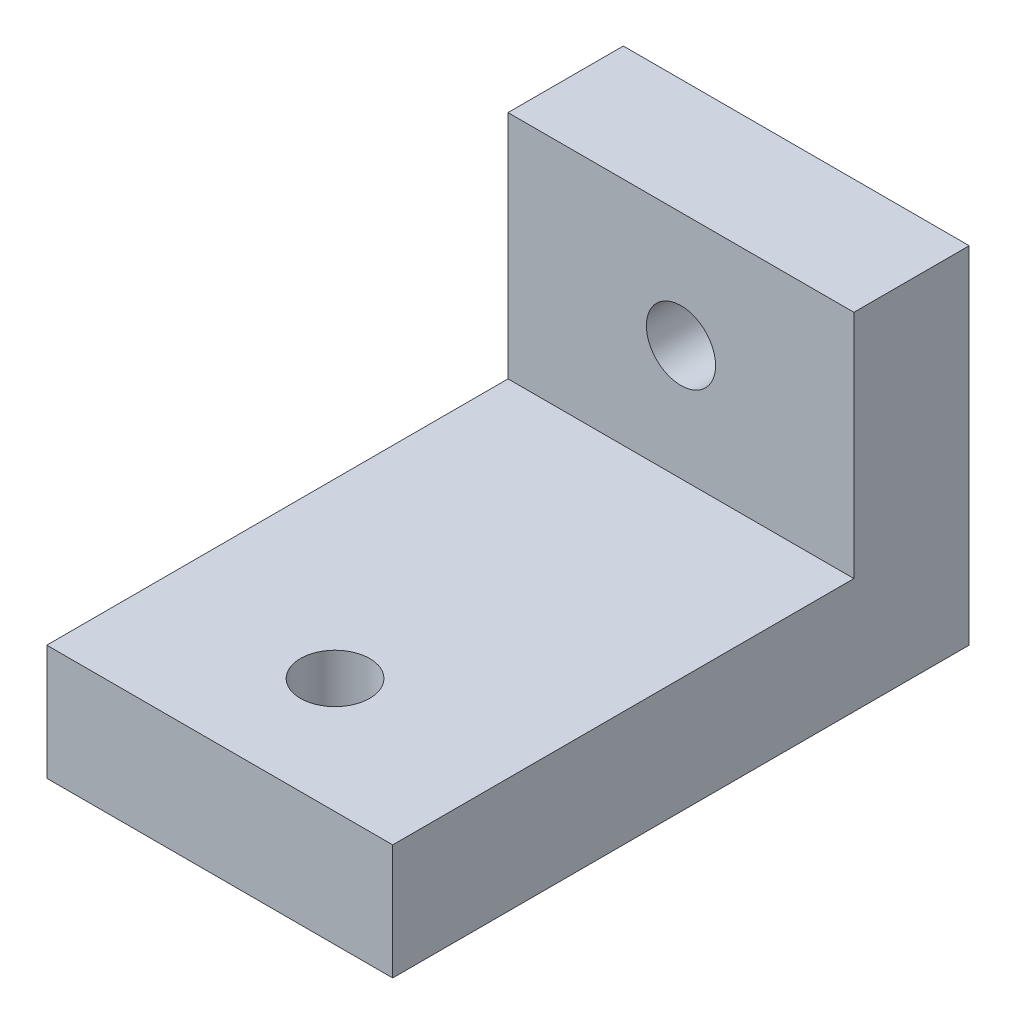
ISO-10303-21;
HEADER;
FILE_DESCRIPTION(('STEP AP214'),'2;1');
FILE_NAME('part.step','',(''),(''),'','','');
FILE_SCHEMA(('AUTOMOTIVE_DESIGN { 1 0 10303 214 1 1 1 1 }'));
ENDSEC;
DATA;
#1=APPLICATION_CONTEXT('core data for automotive mechanical design processes');
#2=APPLICATION_PROTOCOL_DEFINITION('international standard','automotive_design',2000,#1);
#3=PRODUCT_CONTEXT('',#1,'mechanical');
#4=PRODUCT('Part','Part','',(#3));
#5=PRODUCT_RELATED_PRODUCT_CATEGORY('part','',(#4));
#6=PRODUCT_DEFINITION_FORMATION('','',#4);
#7=PRODUCT_DEFINITION_CONTEXT('part definition',#1,'design');
#8=PRODUCT_DEFINITION('design','',#6,#7);
#9=PRODUCT_DEFINITION_SHAPE('','',#8);
#10=(LENGTH_UNIT() NAMED_UNIT(*) SI_UNIT(.MILLI.,.METRE.));
#11=(NAMED_UNIT(*) PLANE_ANGLE_UNIT() SI_UNIT($,.RADIAN.));
#12=(NAMED_UNIT(*) SI_UNIT($,.STERADIAN.) SOLID_ANGLE_UNIT());
#13=UNCERTAINTY_MEASURE_WITH_UNIT(LENGTH_MEASURE(1.E-05),#10,'distance_accuracy_value','');
#14=(GEOMETRIC_REPRESENTATION_CONTEXT(3) GLOBAL_UNCERTAINTY_ASSIGNED_CONTEXT((#13)) GLOBAL_UNIT_ASSIGNED_CONTEXT((#10,
#11,#12)) REPRESENTATION_CONTEXT('',''));
#15=CARTESIAN_POINT('',(0.,0.,0.));
#16=DIRECTION('',(0.,0.,1.));
#17=DIRECTION('',(1.,0.,0.));
#18=AXIS2_PLACEMENT_3D('',#15,#16,#17);
#19=CARTESIAN_POINT('',(7.5,5.,-12.5));
#20=DIRECTION('',(-1.,0.,0.));
#21=DIRECTION('',(0.,0.,1.));
#22=AXIS2_PLACEMENT_3D('',#19,#20,#21);
#23=PLANE('',#22);
#24=DIRECTION('',(0.,0.,-1.));
#25=VECTOR('',#24,1.);
#26=CARTESIAN_POINT('',(7.5,0.,-12.5));
#27=LINE('',#26,#25);
#28=CARTESIAN_POINT('',(7.5,0.,12.5));
#29=VERTEX_POINT('',#28);
#30=CARTESIAN_POINT('',(7.5,0.,-12.5));
#31=VERTEX_POINT('',#30);
#32=EDGE_CURVE('E91',#29,#31,#27,.T.);
#33=ORIENTED_EDGE('',*,*,#32,.T.);
#34=DIRECTION('',(0.,-1.,0.));
#35=VECTOR('',#34,1.);
#36=CARTESIAN_POINT('',(7.5,5.,-12.5));
#37=LINE('',#36,#35);
#38=CARTESIAN_POINT('',(7.5,15.,-12.5));
#39=VERTEX_POINT('',#38);
#40=EDGE_CURVE('E11',#39,#31,#37,.T.);
#41=ORIENTED_EDGE('',*,*,#40,.F.);
#42=DIRECTION('',(0.,0.,-1.));
#43=VECTOR('',#42,1.);
#44=CARTESIAN_POINT('',(7.5,15.,-12.5));
#45=LINE('',#44,#43);
#46=CARTESIAN_POINT('',(7.5,15.,-7.5));
#47=VERTEX_POINT('',#46);
#48=EDGE_CURVE('E128',#47,#39,#45,.T.);
#49=ORIENTED_EDGE('',*,*,#48,.F.);
#50=DIRECTION('',(0.,-1.,0.));
#51=VECTOR('',#50,1.);
#52=CARTESIAN_POINT('',(7.5,15.,-7.5));
#53=LINE('',#52,#51);
#54=CARTESIAN_POINT('',(7.5,5.,-7.5));
#55=VERTEX_POINT('',#54);
#56=EDGE_CURVE('E100',#47,#55,#53,.T.);
#57=ORIENTED_EDGE('',*,*,#56,.T.);
#58=DIRECTION('',(0.,0.,-1.));
#59=VECTOR('',#58,1.);
#60=CARTESIAN_POINT('',(7.5,5.,-12.5));
#61=LINE('',#60,#59);
#62=CARTESIAN_POINT('',(7.5,5.,12.5));
#63=VERTEX_POINT('',#62);
#64=EDGE_CURVE('E85',#63,#55,#61,.T.);
#65=ORIENTED_EDGE('',*,*,#64,.F.);
#66=DIRECTION('',(0.,-1.,0.));
#67=VECTOR('',#66,1.);
#68=CARTESIAN_POINT('',(7.5,5.,12.5));
#69=LINE('',#68,#67);
#70=EDGE_CURVE('E78',#63,#29,#69,.T.);
#71=ORIENTED_EDGE('',*,*,#70,.T.);
#72=EDGE_LOOP('',(#33,#41,#49,#57,#65,#71));
#73=FACE_BOUND('',#72,.T.);
#74=ADVANCED_FACE('F35',(#73),#23,.F.);
#75=CARTESIAN_POINT('',(-7.5,5.,-12.5));
#76=DIRECTION('',(0.,0.,1.));
#77=DIRECTION('',(1.,0.,0.));
#78=AXIS2_PLACEMENT_3D('',#75,#76,#77);
#79=PLANE('',#78);
#80=CARTESIAN_POINT('',(0.,10.,-12.5));
#81=DIRECTION('',(0.,0.,1.));
#82=DIRECTION('',(1.,0.,0.));
#83=AXIS2_PLACEMENT_3D('',#80,#81,#82);
#84=CIRCLE('',#83,1.5);
#85=CARTESIAN_POINT('',(1.5,10.,-12.5));
#86=VERTEX_POINT('',#85);
#87=EDGE_CURVE('E150',#86,#86,#84,.T.);
#88=ORIENTED_EDGE('',*,*,#87,.T.);
#89=EDGE_LOOP('',(#88));
#90=FACE_BOUND('',#89,.T.);
#91=DIRECTION('',(-1.,0.,0.));
#92=VECTOR('',#91,1.);
#93=CARTESIAN_POINT('',(-7.5,0.,-12.5));
#94=LINE('',#93,#92);
#95=CARTESIAN_POINT('',(-7.5,0.,-12.5));
#96=VERTEX_POINT('',#95);
#97=EDGE_CURVE('E95',#31,#96,#94,.T.);
#98=ORIENTED_EDGE('',*,*,#97,.T.);
#99=DIRECTION('',(0.,-1.,0.));
#100=VECTOR('',#99,1.);
#101=CARTESIAN_POINT('',(-7.5,5.,-12.5));
#102=LINE('',#101,#100);
#103=CARTESIAN_POINT('',(-7.5,15.,-12.5));
#104=VERTEX_POINT('',#103);
#105=EDGE_CURVE('E43',#104,#96,#102,.T.);
#106=ORIENTED_EDGE('',*,*,#105,.F.);
#107=DIRECTION('',(-1.,0.,0.));
#108=VECTOR('',#107,1.);
#109=CARTESIAN_POINT('',(-7.5,15.,-12.5));
#110=LINE('',#109,#108);
#111=EDGE_CURVE('E120',#39,#104,#110,.T.);
#112=ORIENTED_EDGE('',*,*,#111,.F.);
#113=ORIENTED_EDGE('',*,*,#40,.T.);
#114=EDGE_LOOP('',(#98,#106,#112,#113));
#115=FACE_BOUND('',#114,.T.);
#116=ADVANCED_FACE('F118',(#90,#115),#79,.F.);
#117=CARTESIAN_POINT('',(-7.5,5.,-12.5));
#118=DIRECTION('',(1.,0.,0.));
#119=DIRECTION('',(0.,0.,-1.));
#120=AXIS2_PLACEMENT_3D('',#117,#118,#119);
#121=PLANE('',#120);
#122=DIRECTION('',(0.,0.,1.));
#123=VECTOR('',#122,1.);
#124=CARTESIAN_POINT('',(-7.5,0.,-12.5));
#125=LINE('',#124,#123);
#126=CARTESIAN_POINT('',(-7.5,0.,12.5));
#127=VERTEX_POINT('',#126);
#128=EDGE_CURVE('E86',#96,#127,#125,.T.);
#129=ORIENTED_EDGE('',*,*,#128,.T.);
#130=DIRECTION('',(0.,-1.,0.));
#131=VECTOR('',#130,1.);
#132=CARTESIAN_POINT('',(-7.5,5.,12.5));
#133=LINE('',#132,#131);
#134=CARTESIAN_POINT('',(-7.5,5.,12.5));
#135=VERTEX_POINT('',#134);
#136=EDGE_CURVE('E81',#135,#127,#133,.T.);
#137=ORIENTED_EDGE('',*,*,#136,.F.);
#138=DIRECTION('',(0.,0.,1.));
#139=VECTOR('',#138,1.);
#140=CARTESIAN_POINT('',(-7.5,5.,-12.5));
#141=LINE('',#140,#139);
#142=CARTESIAN_POINT('',(-7.5,5.,-7.5));
#143=VERTEX_POINT('',#142);
#144=EDGE_CURVE('E136',#143,#135,#141,.T.);
#145=ORIENTED_EDGE('',*,*,#144,.F.);
#146=DIRECTION('',(0.,-1.,0.));
#147=VECTOR('',#146,1.);
#148=CARTESIAN_POINT('',(-7.5,15.,-7.5));
#149=LINE('',#148,#147);
#150=CARTESIAN_POINT('',(-7.5,15.,-7.5));
#151=VERTEX_POINT('',#150);
#152=EDGE_CURVE('E96',#151,#143,#149,.T.);
#153=ORIENTED_EDGE('',*,*,#152,.F.);
#154=DIRECTION('',(0.,0.,1.));
#155=VECTOR('',#154,1.);
#156=CARTESIAN_POINT('',(-7.5,15.,-12.5));
#157=LINE('',#156,#155);
#158=EDGE_CURVE('E114',#104,#151,#157,.T.);
#159=ORIENTED_EDGE('',*,*,#158,.F.);
#160=ORIENTED_EDGE('',*,*,#105,.T.);
#161=EDGE_LOOP('',(#129,#137,#145,#153,#159,#160));
#162=FACE_BOUND('',#161,.T.);
#163=ADVANCED_FACE('F111',(#162),#121,.F.);
#164=CARTESIAN_POINT('',(-7.5,5.,12.5));
#165=DIRECTION('',(0.,0.,-1.));
#166=DIRECTION('',(-1.,0.,0.));
#167=AXIS2_PLACEMENT_3D('',#164,#165,#166);
#168=PLANE('',#167);
#169=DIRECTION('',(1.,0.,0.));
#170=VECTOR('',#169,1.);
#171=CARTESIAN_POINT('',(-7.5,0.,12.5));
#172=LINE('',#171,#170);
#173=EDGE_CURVE('E75',#127,#29,#172,.T.);
#174=ORIENTED_EDGE('',*,*,#173,.T.);
#175=ORIENTED_EDGE('',*,*,#70,.F.);
#176=DIRECTION('',(1.,0.,0.));
#177=VECTOR('',#176,1.);
#178=CARTESIAN_POINT('',(-7.5,5.,12.5));
#179=LINE('',#178,#177);
#180=EDGE_CURVE('E56',#135,#63,#179,.T.);
#181=ORIENTED_EDGE('',*,*,#180,.F.);
#182=ORIENTED_EDGE('',*,*,#136,.T.);
#183=EDGE_LOOP('',(#174,#175,#181,#182));
#184=FACE_BOUND('',#183,.T.);
#185=ADVANCED_FACE('F77',(#184),#168,.F.);
#186=CARTESIAN_POINT('',(0.,5.,0.));
#187=DIRECTION('',(0.,1.,0.));
#188=DIRECTION('',(0.,0.,1.));
#189=AXIS2_PLACEMENT_3D('',#186,#187,#188);
#190=PLANE('',#189);
#191=CARTESIAN_POINT('',(0.,5.,7.5));
#192=DIRECTION('',(0.,1.,0.));
#193=DIRECTION('',(0.,0.,1.));
#194=AXIS2_PLACEMENT_3D('',#191,#192,#193);
#195=CIRCLE('',#194,1.5);
#196=CARTESIAN_POINT('',(0.,5.,9.));
#197=VERTEX_POINT('',#196);
#198=EDGE_CURVE('E147',#197,#197,#195,.T.);
#199=ORIENTED_EDGE('',*,*,#198,.F.);
#200=EDGE_LOOP('',(#199));
#201=FACE_BOUND('',#200,.T.);
#202=DIRECTION('',(1.,0.,0.));
#203=VECTOR('',#202,1.);
#204=CARTESIAN_POINT('',(-7.5,5.,-7.5));
#205=LINE('',#204,#203);
#206=EDGE_CURVE('E50',#143,#55,#205,.T.);
#207=ORIENTED_EDGE('',*,*,#206,.F.);
#208=ORIENTED_EDGE('',*,*,#144,.T.);
#209=ORIENTED_EDGE('',*,*,#180,.T.);
#210=ORIENTED_EDGE('',*,*,#64,.T.);
#211=EDGE_LOOP('',(#207,#208,#209,#210));
#212=FACE_BOUND('',#211,.T.);
#213=ADVANCED_FACE('F137',(#201,#212),#190,.T.);
#214=CARTESIAN_POINT('',(0.,0.,0.));
#215=DIRECTION('',(0.,1.,0.));
#216=DIRECTION('',(0.,0.,1.));
#217=AXIS2_PLACEMENT_3D('',#214,#215,#216);
#218=PLANE('',#217);
#219=CARTESIAN_POINT('',(0.,0.,7.5));
#220=DIRECTION('',(0.,1.,0.));
#221=DIRECTION('',(0.,0.,1.));
#222=AXIS2_PLACEMENT_3D('',#219,#220,#221);
#223=CIRCLE('',#222,1.5);
#224=CARTESIAN_POINT('',(0.,0.,9.));
#225=VERTEX_POINT('',#224);
#226=EDGE_CURVE('E38',#225,#225,#223,.T.);
#227=ORIENTED_EDGE('',*,*,#226,.T.);
#228=EDGE_LOOP('',(#227));
#229=FACE_BOUND('',#228,.T.);
#230=ORIENTED_EDGE('',*,*,#32,.F.);
#231=ORIENTED_EDGE('',*,*,#173,.F.);
#232=ORIENTED_EDGE('',*,*,#128,.F.);
#233=ORIENTED_EDGE('',*,*,#97,.F.);
#234=EDGE_LOOP('',(#230,#231,#232,#233));
#235=FACE_BOUND('',#234,.T.);
#236=ADVANCED_FACE('F94',(#229,#235),#218,.F.);
#237=CARTESIAN_POINT('',(-7.5,15.,-7.5));
#238=DIRECTION('',(0.,0.,-1.));
#239=DIRECTION('',(-1.,0.,0.));
#240=AXIS2_PLACEMENT_3D('',#237,#238,#239);
#241=PLANE('',#240);
#242=CARTESIAN_POINT('',(0.,10.,-7.5));
#243=DIRECTION('',(0.,0.,1.));
#244=DIRECTION('',(1.,0.,0.));
#245=AXIS2_PLACEMENT_3D('',#242,#243,#244);
#246=CIRCLE('',#245,1.5);
#247=CARTESIAN_POINT('',(1.5,10.,-7.5));
#248=VERTEX_POINT('',#247);
#249=EDGE_CURVE('E153',#248,#248,#246,.T.);
#250=ORIENTED_EDGE('',*,*,#249,.F.);
#251=EDGE_LOOP('',(#250));
#252=FACE_BOUND('',#251,.T.);
#253=ORIENTED_EDGE('',*,*,#206,.T.);
#254=ORIENTED_EDGE('',*,*,#56,.F.);
#255=DIRECTION('',(1.,0.,0.));
#256=VECTOR('',#255,1.);
#257=CARTESIAN_POINT('',(-7.5,15.,-7.5));
#258=LINE('',#257,#256);
#259=EDGE_CURVE('E131',#151,#47,#258,.T.);
#260=ORIENTED_EDGE('',*,*,#259,.F.);
#261=ORIENTED_EDGE('',*,*,#152,.T.);
#262=EDGE_LOOP('',(#253,#254,#260,#261));
#263=FACE_BOUND('',#262,.T.);
#264=ADVANCED_FACE('F140',(#252,#263),#241,.F.);
#265=CARTESIAN_POINT('',(0.,15.,0.));
#266=DIRECTION('',(0.,1.,0.));
#267=DIRECTION('',(0.,0.,1.));
#268=AXIS2_PLACEMENT_3D('',#265,#266,#267);
#269=PLANE('',#268);
#270=ORIENTED_EDGE('',*,*,#158,.T.);
#271=ORIENTED_EDGE('',*,*,#259,.T.);
#272=ORIENTED_EDGE('',*,*,#48,.T.);
#273=ORIENTED_EDGE('',*,*,#111,.T.);
#274=EDGE_LOOP('',(#270,#271,#272,#273));
#275=FACE_BOUND('',#274,.T.);
#276=ADVANCED_FACE('F124',(#275),#269,.T.);
#277=CARTESIAN_POINT('',(0.,-5.,7.5));
#278=DIRECTION('',(0.,1.,0.));
#279=DIRECTION('',(0.,0.,1.));
#280=AXIS2_PLACEMENT_3D('',#277,#278,#279);
#281=CYLINDRICAL_SURFACE('',#280,1.5);
#282=ORIENTED_EDGE('',*,*,#198,.T.);
#283=EDGE_LOOP('',(#282));
#284=FACE_BOUND('',#283,.T.);
#285=ORIENTED_EDGE('',*,*,#226,.F.);
#286=EDGE_LOOP('',(#285));
#287=FACE_BOUND('',#286,.T.);
#288=ADVANCED_FACE('F166',(#284,#287),#281,.F.);
#289=CARTESIAN_POINT('',(0.,10.,-17.5));
#290=DIRECTION('',(0.,0.,1.));
#291=DIRECTION('',(1.,0.,0.));
#292=AXIS2_PLACEMENT_3D('',#289,#290,#291);
#293=CYLINDRICAL_SURFACE('',#292,1.5);
#294=ORIENTED_EDGE('',*,*,#249,.T.);
#295=EDGE_LOOP('',(#294));
#296=FACE_BOUND('',#295,.T.);
#297=ORIENTED_EDGE('',*,*,#87,.F.);
#298=EDGE_LOOP('',(#297));
#299=FACE_BOUND('',#298,.T.);
#300=ADVANCED_FACE('F157',(#296,#299),#293,.F.);
#301=CLOSED_SHELL('',(#74,#116,#163,#185,#213,#236,#264,#276,#288,#300));
#302=MANIFOLD_SOLID_BREP('B2',#301);
#303=ADVANCED_BREP_SHAPE_REPRESENTATION('',(#18,#302),#14);
#304=SHAPE_DEFINITION_REPRESENTATION(#9,#303);
ENDSEC;
END-ISO-10303-21;
